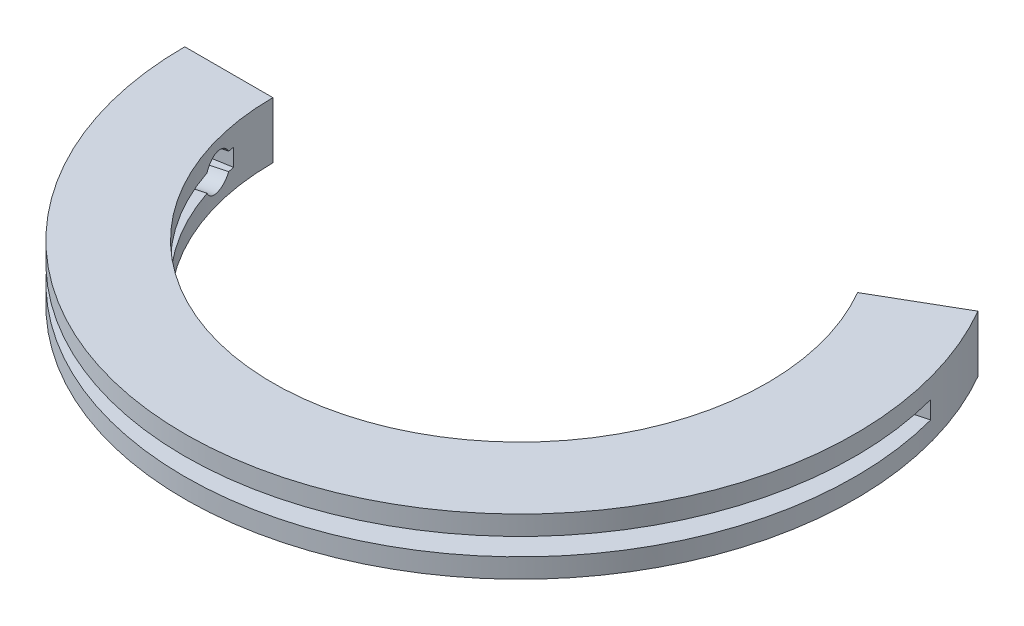
ISO-10303-21;
HEADER;
FILE_DESCRIPTION(('STEP AP214'),'2;1');
FILE_NAME('part.step','',(''),(''),'','','');
FILE_SCHEMA(('AUTOMOTIVE_DESIGN { 1 0 10303 214 1 1 1 1 }'));
ENDSEC;
DATA;
#1=APPLICATION_CONTEXT('core data for automotive mechanical design processes');
#2=APPLICATION_PROTOCOL_DEFINITION('international standard','automotive_design',2000,#1);
#3=PRODUCT_CONTEXT('',#1,'mechanical');
#4=PRODUCT('Part','Part','',(#3));
#5=PRODUCT_RELATED_PRODUCT_CATEGORY('part','',(#4));
#6=PRODUCT_DEFINITION_FORMATION('','',#4);
#7=PRODUCT_DEFINITION_CONTEXT('part definition',#1,'design');
#8=PRODUCT_DEFINITION('design','',#6,#7);
#9=PRODUCT_DEFINITION_SHAPE('','',#8);
#10=(LENGTH_UNIT() NAMED_UNIT(*) SI_UNIT(.MILLI.,.METRE.));
#11=(NAMED_UNIT(*) PLANE_ANGLE_UNIT() SI_UNIT($,.RADIAN.));
#12=(NAMED_UNIT(*) SI_UNIT($,.STERADIAN.) SOLID_ANGLE_UNIT());
#13=UNCERTAINTY_MEASURE_WITH_UNIT(LENGTH_MEASURE(1.E-05),#10,'distance_accuracy_value','');
#14=(GEOMETRIC_REPRESENTATION_CONTEXT(3) GLOBAL_UNCERTAINTY_ASSIGNED_CONTEXT((#13)) GLOBAL_UNIT_ASSIGNED_CONTEXT((#10,
#11,#12)) REPRESENTATION_CONTEXT('',''));
#15=CARTESIAN_POINT('',(0.,0.,0.));
#16=DIRECTION('',(0.,0.,1.));
#17=DIRECTION('',(1.,0.,0.));
#18=AXIS2_PLACEMENT_3D('',#15,#16,#17);
#19=CARTESIAN_POINT('',(-724.444369716801,0.,194.114283826891));
#20=DIRECTION('',(-0.965925826289068,0.,0.258819045102522));
#21=DIRECTION('',(0.,1.,0.));
#22=AXIS2_PLACEMENT_3D('',#19,#20,#21);
#23=SPHERICAL_SURFACE('',#22,50.);
#24=CARTESIAN_POINT('',(-724.444369716801,25.,194.114283826891));
#25=DIRECTION('',(0.,1.,0.));
#26=DIRECTION('',(0.,0.,1.));
#27=AXIS2_PLACEMENT_3D('',#24,#25,#26);
#28=CIRCLE('',#27,43.301270189222);
#29=CARTESIAN_POINT('',(-735.651563118902,25.,152.288468640001));
#30=VERTEX_POINT('',#29);
#31=CARTESIAN_POINT('',(-713.2371763147,25.,235.940099013782));
#32=VERTEX_POINT('',#31);
#33=EDGE_CURVE('E259',#30,#32,#28,.T.);
#34=ORIENTED_EDGE('',*,*,#33,.F.);
#35=CARTESIAN_POINT('',(-724.444369716801,0.,194.114283826891));
#36=DIRECTION('',(-0.965925826289068,0.,0.258819045102522));
#37=DIRECTION('',(0.258819045102522,0.,0.965925826289068));
#38=AXIS2_PLACEMENT_3D('',#35,#36,#37);
#39=CIRCLE('',#38,50.);
#40=EDGE_CURVE('E160',#32,#30,#39,.T.);
#41=ORIENTED_EDGE('',*,*,#40,.F.);
#42=EDGE_LOOP('',(#34,#41));
#43=FACE_BOUND('',#42,.T.);
#44=ADVANCED_FACE('F32',(#43),#23,.F.);
#45=CARTESIAN_POINT('',(-1280.94708628317,0.,343.228737316575));
#46=DIRECTION('',(-0.965925826289068,0.,0.258819045102522));
#47=DIRECTION('',(0.258819045102522,0.,0.965925826289068));
#48=AXIS2_PLACEMENT_3D('',#45,#46,#47);
#49=CYLINDRICAL_SURFACE('',#48,50.);
#50=DIRECTION('',(-0.965925826289068,0.,0.258819045102522));
#51=VECTOR('',#50,1.);
#52=CARTESIAN_POINT('',(-1292.15427968527,25.,301.402922129684));
#53=LINE('',#52,#51);
#54=CARTESIAN_POINT('',(-686.06038122234,25.,139.000551499112));
#55=VERTEX_POINT('',#54);
#56=EDGE_CURVE('E154',#55,#30,#53,.T.);
#57=ORIENTED_EDGE('',*,*,#56,.F.);
#58=CARTESIAN_POINT('',(-661.480052883694,0.,229.006854999987));
#59=CARTESIAN_POINT('',(-661.480056860518,-1.40258138758616,229.006846549775));
#60=CARTESIAN_POINT('',(-661.499434028042,-2.8054197073984,228.950896875702));
#61=CARTESIAN_POINT('',(-661.576734718559,-5.60132910441514,228.7274308773));
#62=CARTESIAN_POINT('',(-661.634667926343,-6.99439763870607,228.559886521788));
#63=CARTESIAN_POINT('',(-661.788489882926,-9.76214309450378,228.114116870368));
#64=CARTESIAN_POINT('',(-661.884418760362,-11.136798977732,227.835774555064));
#65=CARTESIAN_POINT('',(-662.113107699471,-13.8562954036039,227.170324226348));
#66=CARTESIAN_POINT('',(-662.245865436422,-15.2011378223575,226.783223078024));
#67=CARTESIAN_POINT('',(-662.546603499333,-17.8508686524215,225.903107896698));
#68=CARTESIAN_POINT('',(-662.71456540823,-19.1557775474942,225.410149239758));
#69=CARTESIAN_POINT('',(-663.083842382239,-21.7171565764191,224.321528430723));
#70=CARTESIAN_POINT('',(-663.285157945634,-22.9736259862698,223.725864744274));
#71=CARTESIAN_POINT('',(-663.718828420348,-25.4289502750043,222.436011899234));
#72=CARTESIAN_POINT('',(-663.951176133052,-26.6278184283746,221.741845588245));
#73=CARTESIAN_POINT('',(-664.444379843492,-28.959802629931,220.259564886649));
#74=CARTESIAN_POINT('',(-664.70523577528,-30.0929188302085,219.471450713365));
#75=CARTESIAN_POINT('',(-665.25309562952,-32.2872965110593,217.805162802851));
#76=CARTESIAN_POINT('',(-665.540143297786,-33.3484324197237,216.926838075611));
#77=CARTESIAN_POINT('',(-666.136951788072,-35.3892405047489,215.087183020595));
#78=CARTESIAN_POINT('',(-666.44671265503,-36.3689125199236,214.125852528589));
#79=CARTESIAN_POINT('',(-667.085738155942,-38.2399074796553,212.126657885203));
#80=CARTESIAN_POINT('',(-667.415003608845,-39.1312267102929,211.088790519781));
#81=CARTESIAN_POINT('',(-668.08968726731,-40.8191568327122,208.943613763269));
#82=CARTESIAN_POINT('',(-668.435105474441,-41.6157677152921,207.836304365432));
#83=CARTESIAN_POINT('',(-669.139061809278,-43.1094135386094,205.558600073748));
#84=CARTESIAN_POINT('',(-669.497613434707,-43.8063422077315,204.388139657789));
#85=CARTESIAN_POINT('',(-670.224057054372,-45.0946412989423,201.993264471338));
#86=CARTESIAN_POINT('',(-670.591949057573,-45.6860116197257,200.768849649065));
#87=CARTESIAN_POINT('',(-671.333665015696,-46.758945236684,198.274564399644));
#88=CARTESIAN_POINT('',(-671.707488906951,-47.24050971057,197.004694460189));
#89=CARTESIAN_POINT('',(-672.457743510548,-48.0903700470097,194.42834957163));
#90=CARTESIAN_POINT('',(-672.834174218161,-48.458666115037,193.121874688934));
#91=CARTESIAN_POINT('',(-673.585784414219,-49.0787930916927,190.483775689633));
#92=CARTESIAN_POINT('',(-673.960964941045,-49.3308234493488,189.152198751023));
#93=CARTESIAN_POINT('',(-674.707687442592,-49.7175314655896,186.471104676368));
#94=CARTESIAN_POINT('',(-675.079229421056,-49.8522092448415,185.12158755877));
#95=CARTESIAN_POINT('',(-675.815822452492,-50.0032360106719,182.414205016055));
#96=CARTESIAN_POINT('',(-676.180873587895,-50.0195865009989,181.056339697249));
#97=CARTESIAN_POINT('',(-676.901859923549,-49.9338440770811,178.341930016447));
#98=CARTESIAN_POINT('',(-677.257795132622,-49.8317512774516,176.985385653174));
#99=CARTESIAN_POINT('',(-677.957519165851,-49.5101568461637,174.285808578682));
#100=CARTESIAN_POINT('',(-678.301328996231,-49.2908700923299,172.942755707464));
#101=CARTESIAN_POINT('',(-678.975360216599,-48.7366039189557,170.27727418511));
#102=CARTESIAN_POINT('',(-679.305581625794,-48.4016246629511,168.954845504824));
#103=CARTESIAN_POINT('',(-679.950573520756,-47.618378384179,166.340106287112));
#104=CARTESIAN_POINT('',(-680.265343923556,-47.1701107531674,165.047795911432));
#105=CARTESIAN_POINT('',(-680.877827812111,-46.1634978884495,162.502606374039));
#106=CARTESIAN_POINT('',(-681.175541274523,-45.6051525040988,161.249727266291));
#107=CARTESIAN_POINT('',(-681.752822695499,-44.3818089014777,158.791324300111));
#108=CARTESIAN_POINT('',(-682.032373890028,-43.7167140627135,157.585844585988));
#109=CARTESIAN_POINT('',(-682.571921182111,-42.2849672804191,155.232182181465));
#110=CARTESIAN_POINT('',(-682.831917271956,-41.5183152968433,154.083999513658));
#111=CARTESIAN_POINT('',(-683.331468083796,-39.8888775218814,151.853256336317));
#112=CARTESIAN_POINT('',(-683.571022550628,-39.0260905307909,150.770696645976));
#113=CARTESIAN_POINT('',(-684.028999006716,-37.2104854326279,148.679100542756));
#114=CARTESIAN_POINT('',(-684.247420962749,-36.2576671840144,147.670064245468));
#115=CARTESIAN_POINT('',(-684.66308585084,-34.2664899853107,145.730727064911));
#116=CARTESIAN_POINT('',(-684.860280340452,-33.2279445516397,144.800607256753));
#117=CARTESIAN_POINT('',(-685.232566100021,-31.074507670613,143.028495046455));
#118=CARTESIAN_POINT('',(-685.407657334838,-29.9596161018892,142.186502784417));
#119=CARTESIAN_POINT('',(-685.73549803517,-27.6613676894512,140.596890437284));
#120=CARTESIAN_POINT('',(-685.888247467067,-26.4780107427226,139.84927049419));
#121=CARTESIAN_POINT('',(-686.17126272283,-24.0512067471607,138.453982267062));
#122=CARTESIAN_POINT('',(-686.301528561864,-22.8077597388686,137.806313915595));
#123=CARTESIAN_POINT('',(-686.53951703871,-20.2694816561277,136.615739706857));
#124=CARTESIAN_POINT('',(-686.647237806781,-18.974646330456,136.072842538908));
#125=CARTESIAN_POINT('',(-686.840101542475,-16.3428857599096,135.095976921114));
#126=CARTESIAN_POINT('',(-686.925244503092,-15.0059605019737,134.662008505071));
#127=CARTESIAN_POINT('',(-687.072959086921,-12.2995571015854,133.906300368879));
#128=CARTESIAN_POINT('',(-687.13553099457,-10.9300793695867,133.584559234458));
#129=CARTESIAN_POINT('',(-687.238124174431,-8.16832893240193,133.05575275427));
#130=CARTESIAN_POINT('',(-687.278145489522,-6.7760562705665,132.848687190443));
#131=CARTESIAN_POINT('',(-687.335592655065,-3.98176103081782,132.551144957284));
#132=CARTESIAN_POINT('',(-687.353068237415,-2.57976679411023,132.460411682249));
#133=CARTESIAN_POINT('',(-687.365596655805,0.227018455411728,132.395383788135));
#134=CARTESIAN_POINT('',(-687.360649524675,1.63180946412831,132.421088998576));
#135=CARTESIAN_POINT('',(-687.328329857599,4.43416855918009,132.588740941604));
#136=CARTESIAN_POINT('',(-687.30095746903,5.83173669292237,132.730686910271));
#137=CARTESIAN_POINT('',(-687.2237732428,8.60970641167448,133.12973636032));
#138=CARTESIAN_POINT('',(-687.17396140839,9.99010799917104,133.386839825019));
#139=CARTESIAN_POINT('',(-687.051942536315,12.7224885446265,134.013917331289));
#140=CARTESIAN_POINT('',(-686.979759097383,14.0744958571807,134.383772429869));
#141=CARTESIAN_POINT('',(-686.812964316539,16.7420061448988,135.233647435763));
#142=CARTESIAN_POINT('',(-686.718352995976,18.0575091548099,135.713667238211));
#143=CARTESIAN_POINT('',(-686.5067040347,20.6427279067446,136.780264332919));
#144=CARTESIAN_POINT('',(-686.389666187864,21.9124432278051,137.366842604557));
#145=CARTESIAN_POINT('',(-686.133203471021,24.3971239152657,138.642164971958));
#146=CARTESIAN_POINT('',(-685.99377856052,25.612089182626,139.330909252523));
#147=CARTESIAN_POINT('',(-685.692374385554,27.9807911410717,140.806731589988));
#148=CARTESIAN_POINT('',(-685.530356089988,29.1344169970126,141.593979569426));
#149=CARTESIAN_POINT('',(-685.184129282041,31.3700116605293,143.260017403269));
#150=CARTESIAN_POINT('',(-684.999920746575,32.4519803935579,144.138807352905));
#151=CARTESIAN_POINT('',(-684.609597811599,34.5366456254157,145.981455081209));
#152=CARTESIAN_POINT('',(-684.403483165079,35.5393412301519,146.945313819077));
#153=CARTESIAN_POINT('',(-683.969771244316,37.4583743581317,148.95101366246));
#154=CARTESIAN_POINT('',(-683.742173949668,38.3747117993522,149.992854842041));
#155=CARTESIAN_POINT('',(-683.265646488178,40.1161387741617,152.148864992768));
#156=CARTESIAN_POINT('',(-683.016678230322,40.9410591132739,153.26316221327));
#157=CARTESIAN_POINT('',(-682.498542630429,42.4918621423953,155.554229780165));
#158=CARTESIAN_POINT('',(-682.229375259923,43.2177446928143,156.73100021461));
#159=CARTESIAN_POINT('',(-681.671833378434,44.5652874149169,159.138423879435));
#160=CARTESIAN_POINT('',(-681.383458976175,45.1869481764946,160.369076804792));
#161=CARTESIAN_POINT('',(-680.788726601364,46.3215972102922,162.875315008768));
#162=CARTESIAN_POINT('',(-680.482368654065,46.8345856351163,164.150900224287));
#163=CARTESIAN_POINT('',(-679.853440593897,47.7477696193408,166.736521838864));
#164=CARTESIAN_POINT('',(-679.530886020681,48.1480709473853,168.046524661906));
#165=CARTESIAN_POINT('',(-678.871030095053,48.8336370833362,170.692658623856));
#166=CARTESIAN_POINT('',(-678.533728748805,49.1189019393251,172.028789751843));
#167=CARTESIAN_POINT('',(-677.846377519397,49.5723293643979,174.717525758807));
#168=CARTESIAN_POINT('',(-677.49632777766,49.7404932321199,176.070130454924));
#169=CARTESIAN_POINT('',(-676.785730952235,49.9585044152979,178.782099920368));
#170=CARTESIAN_POINT('',(-676.425183885013,50.0083519163355,180.141464679089));
#171=CARTESIAN_POINT('',(-675.696909307602,49.9893906682516,182.85418971655));
#172=CARTESIAN_POINT('',(-675.329199587818,49.9208460732281,184.207556625391));
#173=CARTESIAN_POINT('',(-674.588539598709,49.6661036179087,186.901723007357));
#174=CARTESIAN_POINT('',(-674.215589337722,49.4799059447818,188.242522500473));
#175=CARTESIAN_POINT('',(-673.467369768419,48.9912007226116,190.902095996549));
#176=CARTESIAN_POINT('',(-673.092100458616,48.6886930989456,192.220869985378));
#177=CARTESIAN_POINT('',(-672.342339287545,47.9695450286976,194.82714815312));
#178=CARTESIAN_POINT('',(-671.96784742681,47.5529045039301,196.114652310612));
#179=CARTESIAN_POINT('',(-671.222886736091,46.6084918443262,198.649393239284));
#180=CARTESIAN_POINT('',(-670.852417799818,46.0807226531786,199.89663107607));
#181=CARTESIAN_POINT('',(-670.118826940657,44.9178167594879,202.34225413916));
#182=CARTESIAN_POINT('',(-669.755705017052,44.2826800674214,203.540639370231));
#183=CARTESIAN_POINT('',(-669.040206364611,42.9095745876363,205.880302536396));
#184=CARTESIAN_POINT('',(-668.687829374419,42.1716083035272,207.021581860937));
#185=CARTESIAN_POINT('',(-667.997210261017,40.5980613912815,209.239279636787));
#186=CARTESIAN_POINT('',(-667.658968150438,39.7624806759157,210.315698030134));
#187=CARTESIAN_POINT('',(-666.999285892835,37.9977485179649,212.398561157569));
#188=CARTESIAN_POINT('',(-666.677882606074,37.0684038442327,213.404853854565));
#189=CARTESIAN_POINT('',(-666.05593957394,35.1241830593027,215.338145175708));
#190=CARTESIAN_POINT('',(-665.755399937055,34.1093065034067,216.265143387534));
#191=CARTESIAN_POINT('',(-665.178271628933,32.0009293359055,218.033788101825));
#192=CARTESIAN_POINT('',(-664.901688953831,30.9074091653935,218.87541324542));
#193=CARTESIAN_POINT('',(-664.375536141273,28.6497083415156,220.467344568444));
#194=CARTESIAN_POINT('',(-664.125965599159,27.4855287470788,221.217652115887));
#195=CARTESIAN_POINT('',(-663.656225621069,25.09296880794,222.622919126039));
#196=CARTESIAN_POINT('',(-663.43609981741,23.8644968591869,223.277737215578));
#197=CARTESIAN_POINT('',(-663.028132937029,21.3535471189995,224.486306922875));
#198=CARTESIAN_POINT('',(-662.840293947257,20.0710658431842,225.040052007634));
#199=CARTESIAN_POINT('',(-662.499240490971,17.4627394594927,226.04211174429));
#200=CARTESIAN_POINT('',(-662.345989130761,16.136942300764,226.490538757095));
#201=CARTESIAN_POINT('',(-662.075643832165,13.4502784852559,227.279599242021));
#202=CARTESIAN_POINT('',(-661.958540707886,12.0894208333483,227.620260099932));
#203=CARTESIAN_POINT('',(-661.797232395286,9.83701103329512,228.08871044864));
#204=CARTESIAN_POINT('',(-661.741959951918,8.95285086953849,228.248985582456));
#205=CARTESIAN_POINT('',(-661.647006264743,7.17652852809934,228.524091662724));
#206=CARTESIAN_POINT('',(-661.607326329109,6.28436568543201,228.638918796208));
#207=CARTESIAN_POINT('',(-661.543763958681,4.49477413925579,228.822765140526));
#208=CARTESIAN_POINT('',(-661.519881502903,3.59734544274288,228.891784412205));
#209=CARTESIAN_POINT('',(-661.488025361266,1.79997961886896,228.983830110923));
#210=CARTESIAN_POINT('',(-661.480050331749,0.900042709800643,229.006860422526));
#211=CARTESIAN_POINT('',(-661.480052883694,0.,229.006854999987));
#212=B_SPLINE_CURVE_WITH_KNOTS('',3,(#58,#59,#60,#61,#62,#63,#64,#65,#66,#67,#68,#69,#70,#71,
#72,#73,#74,#75,#76,#77,#78,#79,#80,#81,#82,#83,#84,#85,#86,#87,#88,#89,#90,#91,#92,#93,#94,#95,
#96,#97,#98,#99,#100,#101,#102,#103,#104,#105,#106,#107,#108,#109,#110,#111,#112,#113,#114,#115,
#116,#117,#118,#119,#120,#121,#122,#123,#124,#125,#126,#127,#128,#129,#130,#131,#132,#133,#134,
#135,#136,#137,#138,#139,#140,#141,#142,#143,#144,#145,#146,#147,#148,#149,#150,#151,#152,#153,
#154,#155,#156,#157,#158,#159,#160,#161,#162,#163,#164,#165,#166,#167,#168,#169,#170,#171,#172,
#173,#174,#175,#176,#177,#178,#179,#180,#181,#182,#183,#184,#185,#186,#187,#188,#189,#190,#191,
#192,#193,#194,#195,#196,#197,#198,#199,#200,#201,#202,#203,#204,#205,#206,#207,#208,#209,#210,
#211),.UNSPECIFIED.,.T.,.F.,(4,2,2,2,2,2,2,2,2,2,2,2,2,2,2,2,2,2,2,2,2,2,2,2,2,2,2,2,2,2,2,2,2,
2,2,2,2,2,2,2,2,2,2,2,2,2,2,2,2,2,2,2,2,2,2,2,2,2,2,2,2,2,2,2,2,2,2,2,2,2,2,2,2,2,2,2,4),(0.,
4.20694220807052,8.41494154595928,12.6273970093917,16.8395866334468,21.0495781262248,
25.2596325193256,29.4687119851629,33.6777817145477,37.894014878135,42.110256383843,
46.3266750446504,50.5430941151282,54.7639753466603,58.9848606289919,63.205700638535,
67.4265329912527,71.640097505736,75.8536576876396,80.0671643219141,84.2806668788571,
88.4864702537043,92.692267683508,96.8980876946777,101.103913461669,105.313567675989,
109.523223550244,113.732931964239,117.942646996559,122.161773831617,126.38090737401,
130.60004726476,134.819184309017,139.038671122151,143.258159244674,147.477594191932,
151.697021115741,155.90712472656,160.117222173347,164.327291952124,168.53736112103,
172.743004318691,176.948643512997,181.154321363286,185.360006821108,189.573049935842,
193.786097433467,197.999192441762,202.212291451619,206.433062221876,210.653838941103,
214.874591769977,219.095338671781,223.312110650128,227.528880865964,231.7456043175,
235.962321155011,240.169641886498,244.376955924762,248.584272662377,252.791592282175,
256.998800468247,261.206008243796,265.413113603637,269.620222723017,273.836186276868,
278.052171751746,282.269209405411,286.486183876535,290.70933958275,294.932768162079,
299.151670204802,303.369499267282,306.069117979868,308.768963135341,311.46880470473,
314.168418216245),.UNSPECIFIED.);
#213=CARTESIAN_POINT('',(-663.645994418139,25.,222.652181872893));
#214=VERTEX_POINT('',#213);
#215=EDGE_CURVE('E166',#55,#214,#212,.T.);
#216=ORIENTED_EDGE('',*,*,#215,.T.);
#217=DIRECTION('',(-0.965925826289068,0.,0.258819045102522));
#218=VECTOR('',#217,1.);
#219=CARTESIAN_POINT('',(-1269.73989288106,25.,385.054552503465));
#220=LINE('',#219,#218);
#221=EDGE_CURVE('E261',#32,#214,#220,.F.);
#222=ORIENTED_EDGE('',*,*,#221,.F.);
#223=ORIENTED_EDGE('',*,*,#40,.T.);
#224=EDGE_LOOP('',(#57,#216,#222,#223));
#225=FACE_BOUND('',#224,.T.);
#226=ADVANCED_FACE('F223',(#225),#49,.F.);
#227=CARTESIAN_POINT('',(0.,0.,0.));
#228=DIRECTION('',(0.,-1.,0.));
#229=DIRECTION('',(0.,0.,-1.));
#230=AXIS2_PLACEMENT_3D('',#227,#228,#229);
#231=CYLINDRICAL_SURFACE('',#230,700.);
#232=CARTESIAN_POINT('',(687.361957393947,0.,-132.41427237108));
#233=CARTESIAN_POINT('',(687.361956612871,1.40258138758617,-132.41428167759));
#234=CARTESIAN_POINT('',(687.350762895164,2.80541970739841,-132.472424100433));
#235=CARTESIAN_POINT('',(687.30597425768,5.60132910441518,-132.704601677189));
#236=CARTESIAN_POINT('',(687.272373709587,6.99439763870612,-132.878665949216));
#237=CARTESIAN_POINT('',(687.182702605938,9.76214309450381,-133.341624769873));
#238=CARTESIAN_POINT('',(687.126608293102,11.136798977732,-133.630640724592));
#239=CARTESIAN_POINT('',(686.991933559578,13.8562954036039,-134.321282083771));
#240=CARTESIAN_POINT('',(686.913354558164,15.2011378223576,-134.72290038053));
#241=CARTESIAN_POINT('',(686.733743769867,17.8508686524215,-135.63547151727));
#242=CARTESIAN_POINT('',(686.63272372137,19.1557775474942,-136.146367191644));
#243=CARTESIAN_POINT('',(686.408216557377,21.7171565764191,-137.273778954361));
#244=CARTESIAN_POINT('',(686.28472910623,22.9736259862699,-137.890296620636));
#245=CARTESIAN_POINT('',(686.015372331683,25.4289502750044,-139.224177188941));
#246=CARTESIAN_POINT('',(685.869508197902,26.6278184283747,-139.94151670506));
#247=CARTESIAN_POINT('',(685.555494789585,28.959802629931,-141.471811303402));
#248=CARTESIAN_POINT('',(685.3873455666,30.0929188302086,-142.284766164443));
#249=CARTESIAN_POINT('',(685.028662162828,32.2872965110593,-144.001743752086));
#250=CARTESIAN_POINT('',(684.838090372024,33.3484324197237,-144.905919112781));
#251=CARTESIAN_POINT('',(684.435114158297,35.3892405047489,-146.797511369769));
#252=CARTESIAN_POINT('',(684.222709692178,36.3689125199236,-147.784928430758));
#253=CARTESIAN_POINT('',(683.776524687941,38.2399074796553,-149.835794529496));
#254=CARTESIAN_POINT('',(683.542743252033,39.1312267102928,-150.899246760162));
#255=CARTESIAN_POINT('',(683.054448061526,40.8191568327122,-153.094366156141));
#256=CARTESIAN_POINT('',(682.799934304913,41.6157677152921,-154.226033328083));
#257=CARTESIAN_POINT('',(682.270726228194,43.1094135386095,-156.550561274409));
#258=CARTESIAN_POINT('',(681.996010836404,43.8063422077316,-157.743485541467));
#259=CARTESIAN_POINT('',(681.427691872226,45.0946412989424,-160.18073010166));
#260=CARTESIAN_POINT('',(681.134088281711,45.6860116197257,-161.425050444119));
#261=CARTESIAN_POINT('',(680.529290519128,46.758945236684,-163.956022813464));
#262=CARTESIAN_POINT('',(680.218096535768,47.24050971057,-165.242674386161));
#263=CARTESIAN_POINT('',(679.57966363751,48.0903700470097,-167.848981810362));
#264=CARTESIAN_POINT('',(679.252424751719,48.458666115037,-169.16863760199));
#265=CARTESIAN_POINT('',(678.584288775598,49.0787930916927,-171.829103451112));
#266=CARTESIAN_POINT('',(678.243416173529,49.3308234493488,-173.169873170454));
#267=CARTESIAN_POINT('',(677.549549792119,49.7175314655896,-175.865129999816));
#268=CARTESIAN_POINT('',(677.196556025242,49.8522092448415,-177.219617095729));
#269=CARTESIAN_POINT('',(676.480773031359,50.0032360106719,-179.932575671201));
#270=CARTESIAN_POINT('',(676.117983928895,50.0195865009989,-181.291047099906));
#271=CARTESIAN_POINT('',(675.385171570952,49.9338440770811,-184.002288007586));
#272=CARTESIAN_POINT('',(675.015148322474,49.8317512774516,-185.355057492078));
#273=CARTESIAN_POINT('',(674.271338573643,49.5101568461637,-188.042821834677));
#274=CARTESIAN_POINT('',(673.897560185214,49.2908700923299,-189.377844654967));
#275=CARTESIAN_POINT('',(673.14854758382,48.7366039189557,-192.023234976827));
#276=CARTESIAN_POINT('',(672.773313372912,48.4016246629511,-193.333602513246));
#277=CARTESIAN_POINT('',(672.024523130329,47.618378384179,-195.920529047537));
#278=CARTESIAN_POINT('',(671.650967107673,47.1701107531673,-197.19708786385));
#279=CARTESIAN_POINT('',(670.908798945874,46.1634978884494,-199.707528604956));
#280=CARTESIAN_POINT('',(670.540186813498,45.6051525040987,-200.941410471342));
#281=CARTESIAN_POINT('',(669.810925706106,44.3818089014777,-203.359090603281));
#282=CARTESIAN_POINT('',(669.450284285164,43.7167140627135,-204.542842256723));
#283=CARTESIAN_POINT('',(668.74071474439,42.2849672804191,-206.850947337014));
#284=CARTESIAN_POINT('',(668.391786629177,41.5183152968432,-207.975300740443));
#285=CARTESIAN_POINT('',(667.709038734041,39.8888775218813,-210.156956407259));
#286=CARTESIAN_POINT('',(667.375219142737,39.0260905307909,-211.214257833622));
#287=CARTESIAN_POINT('',(666.726040336434,37.2104854326279,-213.254621421512));
#288=CARTESIAN_POINT('',(666.410681150459,36.2576671840144,-214.23768346632));
#289=CARTESIAN_POINT('',(665.800988912729,34.2664899853107,-216.125031175231));
#290=CARTESIAN_POINT('',(665.50670444614,33.2279445516397,-217.029135802465));
#291=CARTESIAN_POINT('',(664.943057266244,31.0745076706129,-218.749972874725));
#292=CARTESIAN_POINT('',(664.673694592557,29.9596161018892,-219.566705180849));
#293=CARTESIAN_POINT('',(664.162806793873,27.6613676894512,-221.1072702058));
#294=CARTESIAN_POINT('',(663.921281710762,26.4780107427225,-221.831102784844));
#295=CARTESIAN_POINT('',(663.468735998348,24.0512067471607,-223.18096546302));
#296=CARTESIAN_POINT('',(663.257715348463,22.8077597388685,-223.806995628135));
#297=CARTESIAN_POINT('',(662.86853231085,20.2694816561276,-224.957057376415));
#298=CARTESIAN_POINT('',(662.690372648541,18.974646330456,-225.481080499537));
#299=CARTESIAN_POINT('',(662.368964734224,16.3428857599096,-226.423502808478));
#300=CARTESIAN_POINT('',(662.22571649305,15.0059605019736,-226.84190196152));
#301=CARTESIAN_POINT('',(661.975787007059,12.2995571015854,-227.570221697223));
#302=CARTESIAN_POINT('',(661.869105301436,10.9300793695867,-227.880143646898));
#303=CARTESIAN_POINT('',(661.693550361356,8.1683289324019,-228.389400082357));
#304=CARTESIAN_POINT('',(661.624677055005,6.77605627056647,-228.588734778426));
#305=CARTESIAN_POINT('',(661.525656643161,3.9817610308178,-228.875137493813));
#306=CARTESIAN_POINT('',(661.495424303904,2.57976679411021,-228.962452606136));
#307=CARTESIAN_POINT('',(661.473760285442,-0.227018455411753,-229.025032623589));
#308=CARTESIAN_POINT('',(661.482328549428,-1.63180946412835,-229.000297692771));
#309=CARTESIAN_POINT('',(661.538164868213,-4.43416855918012,-228.838947017578));
#310=CARTESIAN_POINT('',(661.585432668683,-5.83173669292239,-228.702332008463));
#311=CARTESIAN_POINT('',(661.718113893021,-8.60970641167451,-228.31815293424));
#312=CARTESIAN_POINT('',(661.803527311362,-9.99010799917108,-228.070588885203));
#313=CARTESIAN_POINT('',(662.011394621539,-12.7224885446265,-227.466514398595));
#314=CARTESIAN_POINT('',(662.133809478981,-14.0744958571808,-227.11011876804));
#315=CARTESIAN_POINT('',(662.414298464499,-16.7420061448988,-226.290708032472));
#316=CARTESIAN_POINT('',(662.57237255863,-18.0575091548099,-225.827693028951));
#317=CARTESIAN_POINT('',(662.922377728834,-20.6427279067446,-224.798168368693));
#318=CARTESIAN_POINT('',(663.114309116089,-21.9124432278051,-224.231657760728));
#319=CARTESIAN_POINT('',(663.52986707188,-24.3971239152657,-222.998964834123));
#320=CARTESIAN_POINT('',(663.753493697748,-25.612089182626,-222.332782335192));
#321=CARTESIAN_POINT('',(664.230381194154,-27.9807911410718,-220.903980611992));
#322=CARTESIAN_POINT('',(664.483693224035,-29.1344169970127,-220.141194714937));
#323=CARTESIAN_POINT('',(665.016870929803,-31.3700116605293,-218.52525022319));
#324=CARTESIAN_POINT('',(665.296736633314,-32.4519803935579,-217.672091534481));
#325=CARTESIAN_POINT('',(665.880030920097,-34.5366456254157,-215.881150324057));
#326=CARTESIAN_POINT('',(666.183459769052,-35.5393412301519,-214.943366848143));
#327=CARTESIAN_POINT('',(666.810704149438,-37.4583743581318,-212.989523871025));
#328=CARTESIAN_POINT('',(667.134519700232,-38.3747117993523,-211.973464295476));
#329=CARTESIAN_POINT('',(667.799839888344,-40.1161387741618,-209.868041003384));
#330=CARTESIAN_POINT('',(668.141375662555,-40.9410591132739,-208.778547174135));
#331=CARTESIAN_POINT('',(668.838190853891,-42.4918621423954,-206.53535665947));
#332=CARTESIAN_POINT('',(669.193470290385,-43.2177446928144,-205.381659883566));
#333=CARTESIAN_POINT('',(669.914336689754,-44.5652874149169,-203.017998891411));
#334=CARTESIAN_POINT('',(670.279923594275,-45.1869481764946,-201.808034993681));
#335=CARTESIAN_POINT('',(671.017989351223,-46.3215972102922,-199.340202853697));
#336=CARTESIAN_POINT('',(671.390468193971,-46.8345856351164,-198.082334678716));
#337=CARTESIAN_POINT('',(672.138611324002,-47.7477696193409,-195.528656645834));
#338=CARTESIAN_POINT('',(672.51427228101,-48.1480709473853,-194.232883635442));
#339=CARTESIAN_POINT('',(673.265887267554,-48.8336370833362,-191.611336439763));
#340=CARTESIAN_POINT('',(673.641841296966,-49.1189019393251,-190.285562267015));
#341=CARTESIAN_POINT('',(674.390945674458,-49.5723293643979,-187.613372966211));
#342=CARTESIAN_POINT('',(674.764096053584,-49.7404932321199,-186.266958067227));
#343=CARTESIAN_POINT('',(675.50468588364,-49.9585044152979,-183.563025203151));
#344=CARTESIAN_POINT('',(675.872125343525,-50.0083519163356,-182.205507255479));
#345=CARTESIAN_POINT('',(676.597783577288,-49.9893906682516,-179.49208117085));
#346=CARTESIAN_POINT('',(676.956021073157,-49.9208460732281,-178.136176187261));
#347=CARTESIAN_POINT('',(677.661673898005,-49.6661036179087,-175.432629663902));
#348=CARTESIAN_POINT('',(678.0090892442,-49.4799059447818,-174.084988110989));
#349=CARTESIAN_POINT('',(678.690898837613,-48.9912007226116,-171.407620115504));
#350=CARTESIAN_POINT('',(679.025293076477,-48.6886930989456,-170.077893684426));
#351=CARTESIAN_POINT('',(679.679119939429,-47.9695450286976,-167.445909996297));
#352=CARTESIAN_POINT('',(679.998552553268,-47.5529045039301,-166.143652758064));
#353=CARTESIAN_POINT('',(680.620768134621,-46.6084918443263,-163.576022376462));
#354=CARTESIAN_POINT('',(680.923551542889,-46.0807226531786,-162.310648257107));
#355=CARTESIAN_POINT('',(681.511054754416,-44.9178167594879,-159.82588112681));
#356=CARTESIAN_POINT('',(681.79577455944,-44.2826800674214,-158.60648811138));
#357=CARTESIAN_POINT('',(682.345966133134,-42.9095745876363,-156.222531046962));
#358=CARTESIAN_POINT('',(682.611438370189,-42.1716083035272,-155.057965663999));
#359=CARTESIAN_POINT('',(683.122193561569,-40.5980613912815,-152.792073495496));
#360=CARTESIAN_POINT('',(683.367476497851,-39.7624806759157,-151.690746766467));
#361=CARTESIAN_POINT('',(683.837606468058,-37.9977485179649,-149.557093256701));
#362=CARTESIAN_POINT('',(684.062409405362,-37.0684038442326,-148.524916574079));
#363=CARTESIAN_POINT('',(684.490436600398,-35.1241830593026,-146.539665660987));
#364=CARTESIAN_POINT('',(684.693660745925,-34.1093065034067,-145.58659184184));
#365=CARTESIAN_POINT('',(685.078175326994,-32.0009293359054,-143.766336434934));
#366=CARTESIAN_POINT('',(685.259460275906,-30.9074091653934,-142.899176342565));
#367=CARTESIAN_POINT('',(685.599764235471,-28.6497083415156,-141.257446969468));
#368=CARTESIAN_POINT('',(685.758783579685,-27.4855287470788,-140.482876301674));
#369=CARTESIAN_POINT('',(686.054610330562,-25.09296880794,-139.031009382738));
#370=CARTESIAN_POINT('',(686.191384837335,-23.8644968591869,-138.353857380509));
#371=CARTESIAN_POINT('',(686.442360008671,-21.3535471189994,-137.103221871556));
#372=CARTESIAN_POINT('',(686.556559214086,-20.0710658431842,-136.529745066048));
#373=CARTESIAN_POINT('',(686.762228125222,-17.4627394594926,-135.491409149851));
#374=CARTESIAN_POINT('',(686.853722060518,-16.136942300764,-135.026434284913));
#375=CARTESIAN_POINT('',(687.014126406603,-13.4502784852558,-134.207915210546));
#376=CARTESIAN_POINT('',(687.083042555071,-12.0894208333482,-133.854342691381));
#377=CARTESIAN_POINT('',(687.177570632871,-9.83701103329505,-133.367998632689));
#378=CARTESIAN_POINT('',(687.209840859694,-8.95285086953841,-133.201560073525));
#379=CARTESIAN_POINT('',(687.265161594551,-7.17652852809927,-132.91583437569));
#380=CARTESIAN_POINT('',(687.288211329014,-6.28436568543196,-132.796551193232));
#381=CARTESIAN_POINT('',(687.325087873657,-4.49477413925577,-132.605554403445));
#382=CARTESIAN_POINT('',(687.338914696088,-3.59734544274287,-132.533840732933));
#383=CARTESIAN_POINT('',(687.357349317523,-1.79997961886896,-132.438198748714));
#384=CARTESIAN_POINT('',(687.361957895166,-0.900042709800646,-132.414266399051));
#385=CARTESIAN_POINT('',(687.361957393947,0.,-132.41427237108));
#386=B_SPLINE_CURVE_WITH_KNOTS('',3,(#232,#233,#234,#235,#236,#237,#238,#239,#240,#241,#242,
#243,#244,#245,#246,#247,#248,#249,#250,#251,#252,#253,#254,#255,#256,#257,#258,#259,#260,#261,
#262,#263,#264,#265,#266,#267,#268,#269,#270,#271,#272,#273,#274,#275,#276,#277,#278,#279,#280,
#281,#282,#283,#284,#285,#286,#287,#288,#289,#290,#291,#292,#293,#294,#295,#296,#297,#298,#299,
#300,#301,#302,#303,#304,#305,#306,#307,#308,#309,#310,#311,#312,#313,#314,#315,#316,#317,#318,
#319,#320,#321,#322,#323,#324,#325,#326,#327,#328,#329,#330,#331,#332,#333,#334,#335,#336,#337,
#338,#339,#340,#341,#342,#343,#344,#345,#346,#347,#348,#349,#350,#351,#352,#353,#354,#355,#356,
#357,#358,#359,#360,#361,#362,#363,#364,#365,#366,#367,#368,#369,#370,#371,#372,#373,#374,#375,
#376,#377,#378,#379,#380,#381,#382,#383,#384,#385),.UNSPECIFIED.,.T.,.F.,(4,2,2,2,2,2,2,2,2,2,2,
2,2,2,2,2,2,2,2,2,2,2,2,2,2,2,2,2,2,2,2,2,2,2,2,2,2,2,2,2,2,2,2,2,2,2,2,2,2,2,2,2,2,2,2,2,2,2,2,
2,2,2,2,2,2,2,2,2,2,2,2,2,2,2,2,2,4),(0.,4.20694220807055,8.41494154595931,12.6273970093917,
16.8395866334468,21.0495781262248,25.2596325193256,29.468711985163,33.6777817145478,
37.8940148781351,42.1102563838431,46.3266750446504,50.5430941151283,54.7639753466604,
58.984860628992,63.2057006385351,67.4265329912529,71.6400975057361,75.8536576876397,
80.0671643219143,84.2806668788571,88.4864702537043,92.692267683508,96.8980876946778,
101.103913461669,105.313567675989,109.523223550244,113.732931964239,117.942646996559,
122.161773831617,126.38090737401,130.60004726476,134.819184309018,139.038671122151,
143.258159244674,147.477594191932,151.697021115741,155.90712472656,160.117222173347,
164.327291952124,168.53736112103,172.743004318691,176.948643512997,181.154321363286,
185.360006821108,189.573049935843,193.786097433468,197.999192441762,202.212291451619,
206.433062221876,210.653838941104,214.874591769978,219.095338671781,223.312110650129,
227.528880865965,231.7456043175,235.962321155011,240.169641886498,244.376955924762,
248.584272662377,252.791592282175,256.998800468247,261.206008243796,265.413113603637,
269.620222723017,273.836186276869,278.052171751746,282.269209405411,286.486183876535,
290.70933958275,294.932768162079,299.151670204802,303.369499267282,306.069117979868,
308.768963135341,311.46880470473,314.168418216245),.UNSPECIFIED.);
#387=CARTESIAN_POINT('',(686.060381222341,25.,-139.000551499112));
#388=VERTEX_POINT('',#387);
#389=CARTESIAN_POINT('',(686.060381222341,-25.,-139.000551499112));
#390=VERTEX_POINT('',#389);
#391=EDGE_CURVE('E170',#388,#390,#386,.T.);
#392=ORIENTED_EDGE('',*,*,#391,.F.);
#393=CARTESIAN_POINT('',(0.,25.,0.));
#394=DIRECTION('',(0.,1.,0.));
#395=DIRECTION('',(0.,0.,1.));
#396=AXIS2_PLACEMENT_3D('',#393,#394,#395);
#397=CIRCLE('',#396,700.);
#398=EDGE_CURVE('E156',#388,#214,#397,.F.);
#399=ORIENTED_EDGE('',*,*,#398,.T.);
#400=ORIENTED_EDGE('',*,*,#215,.F.);
#401=CARTESIAN_POINT('',(-689.365427108546,25.,121.553724366852));
#402=VERTEX_POINT('',#401);
#403=EDGE_CURVE('E148',#55,#402,#397,.F.);
#404=ORIENTED_EDGE('',*,*,#403,.T.);
#405=DIRECTION('',(0.,-1.,0.));
#406=VECTOR('',#405,1.);
#407=CARTESIAN_POINT('',(-689.365427108546,0.,121.553724366852));
#408=LINE('',#407,#406);
#409=CARTESIAN_POINT('',(-689.365427108546,-25.,121.553724366852));
#410=VERTEX_POINT('',#409);
#411=EDGE_CURVE('E147',#402,#410,#408,.T.);
#412=ORIENTED_EDGE('',*,*,#411,.T.);
#413=CARTESIAN_POINT('',(0.,-25.,0.));
#414=DIRECTION('',(0.,-1.,0.));
#415=DIRECTION('',(0.,0.,-1.));
#416=AXIS2_PLACEMENT_3D('',#413,#414,#415);
#417=CIRCLE('',#416,700.);
#418=CARTESIAN_POINT('',(-686.06038122234,-25.,139.000551499112));
#419=VERTEX_POINT('',#418);
#420=EDGE_CURVE('E272',#410,#419,#417,.F.);
#421=ORIENTED_EDGE('',*,*,#420,.T.);
#422=CARTESIAN_POINT('',(-663.645994418139,-25.,222.652181872893));
#423=VERTEX_POINT('',#422);
#424=EDGE_CURVE('E200',#423,#419,#212,.T.);
#425=ORIENTED_EDGE('',*,*,#424,.F.);
#426=EDGE_CURVE('E279',#423,#390,#417,.F.);
#427=ORIENTED_EDGE('',*,*,#426,.T.);
#428=EDGE_LOOP('',(#392,#399,#400,#404,#412,#421,#425,#427));
#429=FACE_BOUND('',#428,.T.);
#430=CARTESIAN_POINT('',(0.,79.9999999999999,0.));
#431=DIRECTION('',(0.,-1.,0.));
#432=DIRECTION('',(0.,0.,-1.));
#433=AXIS2_PLACEMENT_3D('',#430,#431,#432);
#434=CIRCLE('',#433,700.);
#435=CARTESIAN_POINT('',(606.217782649104,79.9999999999999,-350.000000000005));
#436=VERTEX_POINT('',#435);
#437=CARTESIAN_POINT('',(-700.,79.9999999999999,0.));
#438=VERTEX_POINT('',#437);
#439=EDGE_CURVE('E192',#436,#438,#434,.T.);
#440=ORIENTED_EDGE('',*,*,#439,.F.);
#441=DIRECTION('',(0.,1.,0.));
#442=VECTOR('',#441,1.);
#443=CARTESIAN_POINT('',(606.217782649104,79.9999999999999,-350.000000000005));
#444=LINE('',#443,#442);
#445=CARTESIAN_POINT('',(606.217782649104,-80.0000000000001,-350.000000000005));
#446=VERTEX_POINT('',#445);
#447=EDGE_CURVE('E184',#446,#436,#444,.T.);
#448=ORIENTED_EDGE('',*,*,#447,.F.);
#449=CARTESIAN_POINT('',(0.,-80.0000000000001,0.));
#450=DIRECTION('',(0.,-1.,0.));
#451=DIRECTION('',(0.,0.,-1.));
#452=AXIS2_PLACEMENT_3D('',#449,#450,#451);
#453=CIRCLE('',#452,700.);
#454=CARTESIAN_POINT('',(-700.,-80.0000000000001,0.));
#455=VERTEX_POINT('',#454);
#456=EDGE_CURVE('E194',#446,#455,#453,.T.);
#457=ORIENTED_EDGE('',*,*,#456,.T.);
#458=DIRECTION('',(0.,1.,0.));
#459=VECTOR('',#458,1.);
#460=CARTESIAN_POINT('',(-700.,79.9999999999999,0.));
#461=LINE('',#460,#459);
#462=EDGE_CURVE('E173',#455,#438,#461,.T.);
#463=ORIENTED_EDGE('',*,*,#462,.T.);
#464=EDGE_LOOP('',(#440,#448,#457,#463));
#465=FACE_BOUND('',#464,.T.);
#466=ADVANCED_FACE('F212',(#429,#465),#231,.F.);
#467=CARTESIAN_POINT('',(0.,0.,0.));
#468=DIRECTION('',(0.,-1.,0.));
#469=DIRECTION('',(0.,0.,-1.));
#470=AXIS2_PLACEMENT_3D('',#467,#468,#469);
#471=CYLINDRICAL_SURFACE('',#470,949.526197637537);
#472=CARTESIAN_POINT('',(0.,-25.,0.));
#473=DIRECTION('',(0.,-1.,0.));
#474=DIRECTION('',(0.,0.,-1.));
#475=AXIS2_PLACEMENT_3D('',#472,#473,#474);
#476=CIRCLE('',#475,949.526197637537);
#477=CARTESIAN_POINT('',(917.171877036154,-25.,-245.755463772382));
#478=VERTEX_POINT('',#477);
#479=CARTESIAN_POINT('',(-935.100761121649,-25.,164.883493866768));
#480=VERTEX_POINT('',#479);
#481=EDGE_CURVE('E270',#478,#480,#476,.T.);
#482=ORIENTED_EDGE('',*,*,#481,.T.);
#483=DIRECTION('',(0.,-1.,0.));
#484=VECTOR('',#483,1.);
#485=CARTESIAN_POINT('',(-935.100761121649,0.,164.883493866768));
#486=LINE('',#485,#484);
#487=CARTESIAN_POINT('',(-935.100761121649,25.,164.883493866768));
#488=VERTEX_POINT('',#487);
#489=EDGE_CURVE('E11',#480,#488,#486,.F.);
#490=ORIENTED_EDGE('',*,*,#489,.T.);
#491=CARTESIAN_POINT('',(0.,25.,0.));
#492=DIRECTION('',(0.,1.,0.));
#493=DIRECTION('',(0.,0.,1.));
#494=AXIS2_PLACEMENT_3D('',#491,#492,#493);
#495=CIRCLE('',#494,949.526197637537);
#496=CARTESIAN_POINT('',(917.171877036154,25.,-245.755463772382));
#497=VERTEX_POINT('',#496);
#498=EDGE_CURVE('E141',#488,#497,#495,.T.);
#499=ORIENTED_EDGE('',*,*,#498,.T.);
#500=DIRECTION('',(0.,-1.,0.));
#501=VECTOR('',#500,1.);
#502=CARTESIAN_POINT('',(917.171877036154,0.,-245.755463772382));
#503=LINE('',#502,#501);
#504=EDGE_CURVE('E130',#478,#497,#503,.F.);
#505=ORIENTED_EDGE('',*,*,#504,.F.);
#506=EDGE_LOOP('',(#482,#490,#499,#505));
#507=FACE_BOUND('',#506,.T.);
#508=CARTESIAN_POINT('',(0.,-80.0000000000001,0.));
#509=DIRECTION('',(0.,-1.,0.));
#510=DIRECTION('',(0.,0.,-1.));
#511=AXIS2_PLACEMENT_3D('',#508,#509,#510);
#512=CIRCLE('',#511,949.526197637537);
#513=CARTESIAN_POINT('',(822.313808712947,-80.0000000000001,-474.763098818775));
#514=VERTEX_POINT('',#513);
#515=CARTESIAN_POINT('',(-949.526197637537,-80.0000000000001,0.));
#516=VERTEX_POINT('',#515);
#517=EDGE_CURVE('E196',#514,#516,#512,.T.);
#518=ORIENTED_EDGE('',*,*,#517,.F.);
#519=DIRECTION('',(0.,-1.,0.));
#520=VECTOR('',#519,1.);
#521=CARTESIAN_POINT('',(822.313808712947,79.9999999999999,-474.763098818775));
#522=LINE('',#521,#520);
#523=CARTESIAN_POINT('',(822.313808712947,79.9999999999999,-474.763098818775));
#524=VERTEX_POINT('',#523);
#525=EDGE_CURVE('E179',#524,#514,#522,.T.);
#526=ORIENTED_EDGE('',*,*,#525,.F.);
#527=CARTESIAN_POINT('',(0.,79.9999999999999,0.));
#528=DIRECTION('',(0.,-1.,0.));
#529=DIRECTION('',(0.,0.,-1.));
#530=AXIS2_PLACEMENT_3D('',#527,#528,#529);
#531=CIRCLE('',#530,949.526197637537);
#532=CARTESIAN_POINT('',(-949.526197637537,79.9999999999999,0.));
#533=VERTEX_POINT('',#532);
#534=EDGE_CURVE('E190',#524,#533,#531,.T.);
#535=ORIENTED_EDGE('',*,*,#534,.T.);
#536=DIRECTION('',(0.,-1.,0.));
#537=VECTOR('',#536,1.);
#538=CARTESIAN_POINT('',(-949.526197637537,79.9999999999999,0.));
#539=LINE('',#538,#537);
#540=EDGE_CURVE('E167',#533,#516,#539,.T.);
#541=ORIENTED_EDGE('',*,*,#540,.T.);
#542=EDGE_LOOP('',(#518,#526,#535,#541));
#543=FACE_BOUND('',#542,.T.);
#544=ADVANCED_FACE('F34',(#507,#543),#471,.T.);
#545=CARTESIAN_POINT('',(822.313808712947,-80.0000000000001,-474.763098818775));
#546=DIRECTION('',(0.,1.,0.));
#547=DIRECTION('',(0.,0.,1.));
#548=AXIS2_PLACEMENT_3D('',#545,#546,#547);
#549=PLANE('',#548);
#550=ORIENTED_EDGE('',*,*,#456,.F.);
#551=DIRECTION('',(-0.866025403784434,0.,0.500000000000007));
#552=VECTOR('',#551,1.);
#553=CARTESIAN_POINT('',(822.313808712947,-80.0000000000001,-474.763098818775));
#554=LINE('',#553,#552);
#555=EDGE_CURVE('E181',#514,#446,#554,.T.);
#556=ORIENTED_EDGE('',*,*,#555,.F.);
#557=ORIENTED_EDGE('',*,*,#517,.T.);
#558=DIRECTION('',(1.,0.,0.));
#559=VECTOR('',#558,1.);
#560=CARTESIAN_POINT('',(-949.526197637537,-80.0000000000001,0.));
#561=LINE('',#560,#559);
#562=EDGE_CURVE('E169',#516,#455,#561,.T.);
#563=ORIENTED_EDGE('',*,*,#562,.T.);
#564=EDGE_LOOP('',(#550,#556,#557,#563));
#565=FACE_BOUND('',#564,.T.);
#566=ADVANCED_FACE('F244',(#565),#549,.F.);
#567=CARTESIAN_POINT('',(606.217782649104,79.9999999999999,-350.000000000005));
#568=DIRECTION('',(0.,-1.,0.));
#569=DIRECTION('',(0.,0.,-1.));
#570=AXIS2_PLACEMENT_3D('',#567,#568,#569);
#571=PLANE('',#570);
#572=DIRECTION('',(0.866025403784434,0.,-0.500000000000007));
#573=VECTOR('',#572,1.);
#574=CARTESIAN_POINT('',(606.217782649104,79.9999999999999,-350.000000000005));
#575=LINE('',#574,#573);
#576=EDGE_CURVE('E187',#436,#524,#575,.T.);
#577=ORIENTED_EDGE('',*,*,#576,.F.);
#578=ORIENTED_EDGE('',*,*,#439,.T.);
#579=DIRECTION('',(-1.,0.,0.));
#580=VECTOR('',#579,1.);
#581=CARTESIAN_POINT('',(-700.,79.9999999999999,0.));
#582=LINE('',#581,#580);
#583=EDGE_CURVE('E176',#438,#533,#582,.T.);
#584=ORIENTED_EDGE('',*,*,#583,.T.);
#585=ORIENTED_EDGE('',*,*,#534,.F.);
#586=EDGE_LOOP('',(#577,#578,#584,#585));
#587=FACE_BOUND('',#586,.T.);
#588=ADVANCED_FACE('F241',(#587),#571,.F.);
#589=CARTESIAN_POINT('',(0.,0.,0.));
#590=DIRECTION('',(-0.500000000000007,0.,-0.866025403784435));
#591=DIRECTION('',(-0.866025403784435,0.,0.500000000000007));
#592=AXIS2_PLACEMENT_3D('',#589,#590,#591);
#593=PLANE('',#592);
#594=ORIENTED_EDGE('',*,*,#525,.T.);
#595=ORIENTED_EDGE('',*,*,#555,.T.);
#596=ORIENTED_EDGE('',*,*,#447,.T.);
#597=ORIENTED_EDGE('',*,*,#576,.T.);
#598=EDGE_LOOP('',(#594,#595,#596,#597));
#599=FACE_BOUND('',#598,.T.);
#600=ADVANCED_FACE('F238',(#599),#593,.T.);
#601=CARTESIAN_POINT('',(0.,0.,0.));
#602=DIRECTION('',(0.,0.,1.));
#603=DIRECTION('',(1.,0.,0.));
#604=AXIS2_PLACEMENT_3D('',#601,#602,#603);
#605=PLANE('',#604);
#606=ORIENTED_EDGE('',*,*,#540,.F.);
#607=ORIENTED_EDGE('',*,*,#583,.F.);
#608=ORIENTED_EDGE('',*,*,#462,.F.);
#609=ORIENTED_EDGE('',*,*,#562,.F.);
#610=EDGE_LOOP('',(#606,#607,#608,#609));
#611=FACE_BOUND('',#610,.T.);
#612=ADVANCED_FACE('F234',(#611),#605,.F.);
#613=CARTESIAN_POINT('',(-724.444369716801,-25.,194.114283826891));
#614=DIRECTION('',(0.,-1.,0.));
#615=DIRECTION('',(0.,0.,-1.));
#616=AXIS2_PLACEMENT_3D('',#613,#614,#615);
#617=CIRCLE('',#616,43.301270189222);
#618=CARTESIAN_POINT('',(-713.2371763147,-25.,235.940099013782));
#619=VERTEX_POINT('',#618);
#620=CARTESIAN_POINT('',(-735.651563118902,-25.,152.288468640001));
#621=VERTEX_POINT('',#620);
#622=EDGE_CURVE('E275',#619,#621,#617,.T.);
#623=ORIENTED_EDGE('',*,*,#622,.F.);
#624=EDGE_CURVE('E151',#621,#619,#39,.T.);
#625=ORIENTED_EDGE('',*,*,#624,.F.);
#626=EDGE_LOOP('',(#623,#625));
#627=FACE_BOUND('',#626,.T.);
#628=ADVANCED_FACE('F231',(#627),#23,.F.);
#629=DIRECTION('',(-0.965925826289068,0.,0.258819045102522));
#630=VECTOR('',#629,1.);
#631=CARTESIAN_POINT('',(-1269.73989288106,-25.,385.054552503465));
#632=LINE('',#631,#630);
#633=EDGE_CURVE('E277',#423,#619,#632,.T.);
#634=ORIENTED_EDGE('',*,*,#633,.F.);
#635=ORIENTED_EDGE('',*,*,#424,.T.);
#636=DIRECTION('',(-0.965925826289068,0.,0.258819045102522));
#637=VECTOR('',#636,1.);
#638=CARTESIAN_POINT('',(-1292.15427968527,-25.,301.402922129684));
#639=LINE('',#638,#637);
#640=EDGE_CURVE('E273',#621,#419,#639,.F.);
#641=ORIENTED_EDGE('',*,*,#640,.F.);
#642=ORIENTED_EDGE('',*,*,#624,.T.);
#643=EDGE_LOOP('',(#634,#635,#641,#642));
#644=FACE_BOUND('',#643,.T.);
#645=ADVANCED_FACE('F221',(#644),#49,.F.);
#646=DIRECTION('',(-0.965925826289068,0.,0.258819045102522));
#647=VECTOR('',#646,1.);
#648=CARTESIAN_POINT('',(-1269.73989288106,25.,385.054552503465));
#649=LINE('',#648,#647);
#650=CARTESIAN_POINT('',(735.651563118903,25.,-152.288468640001));
#651=VERTEX_POINT('',#650);
#652=EDGE_CURVE('E267',#388,#651,#649,.F.);
#653=ORIENTED_EDGE('',*,*,#652,.F.);
#654=ORIENTED_EDGE('',*,*,#391,.T.);
#655=DIRECTION('',(-0.965925826289068,0.,0.258819045102522));
#656=VECTOR('',#655,1.);
#657=CARTESIAN_POINT('',(-1269.73989288106,-25.,385.054552503465));
#658=LINE('',#657,#656);
#659=CARTESIAN_POINT('',(735.651563118903,-25.,-152.288468640001));
#660=VERTEX_POINT('',#659);
#661=EDGE_CURVE('E135',#660,#390,#658,.T.);
#662=ORIENTED_EDGE('',*,*,#661,.F.);
#663=CARTESIAN_POINT('',(724.444369716802,0.,-194.114283826891));
#664=DIRECTION('',(-0.965925826289068,0.,0.258819045102522));
#665=DIRECTION('',(0.258819045102522,0.,0.965925826289068));
#666=AXIS2_PLACEMENT_3D('',#663,#664,#665);
#667=CIRCLE('',#666,50.);
#668=EDGE_CURVE('E163',#651,#660,#667,.T.);
#669=ORIENTED_EDGE('',*,*,#668,.F.);
#670=EDGE_LOOP('',(#653,#654,#662,#669));
#671=FACE_BOUND('',#670,.T.);
#672=ADVANCED_FACE('F215',(#671),#49,.F.);
#673=CARTESIAN_POINT('',(724.444369716801,0.,-194.114283826891));
#674=DIRECTION('',(-0.965925826289068,0.,0.258819045102522));
#675=DIRECTION('',(0.,1.,0.));
#676=AXIS2_PLACEMENT_3D('',#673,#674,#675);
#677=SPHERICAL_SURFACE('',#676,50.);
#678=CARTESIAN_POINT('',(724.444369716801,25.,-194.114283826891));
#679=DIRECTION('',(0.,1.,0.));
#680=DIRECTION('',(0.,0.,1.));
#681=AXIS2_PLACEMENT_3D('',#678,#679,#680);
#682=CIRCLE('',#681,43.301270189222);
#683=CARTESIAN_POINT('',(766.27018490369,25.,-205.321477228997));
#684=VERTEX_POINT('',#683);
#685=EDGE_CURVE('E40',#651,#684,#682,.T.);
#686=ORIENTED_EDGE('',*,*,#685,.F.);
#687=ORIENTED_EDGE('',*,*,#668,.T.);
#688=CARTESIAN_POINT('',(724.444369716801,-25.,-194.114283826891));
#689=DIRECTION('',(0.,-1.,0.));
#690=DIRECTION('',(0.,0.,-1.));
#691=AXIS2_PLACEMENT_3D('',#688,#689,#690);
#692=CIRCLE('',#691,43.301270189222);
#693=CARTESIAN_POINT('',(766.27018490369,-25.,-205.321477228997));
#694=VERTEX_POINT('',#693);
#695=EDGE_CURVE('E289',#694,#660,#692,.T.);
#696=ORIENTED_EDGE('',*,*,#695,.F.);
#697=CARTESIAN_POINT('',(724.4443697168,0.,-194.114283826896));
#698=DIRECTION('',(0.258819045102528,0.,0.965925826289066));
#699=DIRECTION('',(0.965925826289066,0.,-0.258819045102528));
#700=AXIS2_PLACEMENT_3D('',#697,#698,#699);
#701=CIRCLE('',#700,50.);
#702=EDGE_CURVE('E199',#694,#684,#701,.T.);
#703=ORIENTED_EDGE('',*,*,#702,.T.);
#704=EDGE_LOOP('',(#686,#687,#696,#703));
#705=FACE_BOUND('',#704,.T.);
#706=ADVANCED_FACE('F220',(#705),#677,.F.);
#707=CARTESIAN_POINT('',(0.,0.,0.));
#708=DIRECTION('',(-0.173648177666931,0.,-0.984807753012208));
#709=DIRECTION('',(-0.984807753012208,0.,0.173648177666931));
#710=AXIS2_PLACEMENT_3D('',#707,#708,#709);
#711=PLANE('',#710);
#712=DIRECTION('',(-0.984807753012208,0.,0.173648177666931));
#713=VECTOR('',#712,1.);
#714=CARTESIAN_POINT('',(-1106.69442347504,25.,195.14008625825));
#715=LINE('',#714,#713);
#716=EDGE_CURVE('E285',#402,#488,#715,.T.);
#717=ORIENTED_EDGE('',*,*,#716,.T.);
#718=ORIENTED_EDGE('',*,*,#489,.F.);
#719=DIRECTION('',(0.984807753012208,0.,-0.173648177666931));
#720=VECTOR('',#719,1.);
#721=CARTESIAN_POINT('',(0.,-25.,0.));
#722=LINE('',#721,#720);
#723=EDGE_CURVE('E136',#480,#410,#722,.T.);
#724=ORIENTED_EDGE('',*,*,#723,.T.);
#725=ORIENTED_EDGE('',*,*,#411,.F.);
#726=EDGE_LOOP('',(#717,#718,#724,#725));
#727=FACE_BOUND('',#726,.T.);
#728=ADVANCED_FACE('F229',(#727),#711,.F.);
#729=CARTESIAN_POINT('',(-1106.69442347504,25.,195.14008625825));
#730=DIRECTION('',(0.,1.,0.));
#731=DIRECTION('',(0.,0.,1.));
#732=AXIS2_PLACEMENT_3D('',#729,#730,#731);
#733=PLANE('',#732);
#734=ORIENTED_EDGE('',*,*,#716,.F.);
#735=ORIENTED_EDGE('',*,*,#403,.F.);
#736=ORIENTED_EDGE('',*,*,#56,.T.);
#737=ORIENTED_EDGE('',*,*,#33,.T.);
#738=ORIENTED_EDGE('',*,*,#221,.T.);
#739=ORIENTED_EDGE('',*,*,#398,.F.);
#740=ORIENTED_EDGE('',*,*,#652,.T.);
#741=ORIENTED_EDGE('',*,*,#685,.T.);
#742=DIRECTION('',(0.965925826289066,0.,-0.258819045102528));
#743=VECTOR('',#742,1.);
#744=CARTESIAN_POINT('',(1085.47553791586,25.,-290.852293788301));
#745=LINE('',#744,#743);
#746=EDGE_CURVE('E52',#684,#497,#745,.T.);
#747=ORIENTED_EDGE('',*,*,#746,.T.);
#748=ORIENTED_EDGE('',*,*,#498,.F.);
#749=EDGE_LOOP('',(#734,#735,#736,#737,#738,#739,#740,#741,#747,#748));
#750=FACE_BOUND('',#749,.T.);
#751=ADVANCED_FACE('F140',(#750),#733,.F.);
#752=CARTESIAN_POINT('',(0.,-25.,0.));
#753=DIRECTION('',(0.,-1.,0.));
#754=DIRECTION('',(0.,0.,-1.));
#755=AXIS2_PLACEMENT_3D('',#752,#753,#754);
#756=PLANE('',#755);
#757=DIRECTION('',(-0.965925826289066,0.,0.258819045102528));
#758=VECTOR('',#757,1.);
#759=CARTESIAN_POINT('',(0.,-25.,0.));
#760=LINE('',#759,#758);
#761=EDGE_CURVE('E47',#478,#694,#760,.T.);
#762=ORIENTED_EDGE('',*,*,#761,.T.);
#763=ORIENTED_EDGE('',*,*,#695,.T.);
#764=ORIENTED_EDGE('',*,*,#661,.T.);
#765=ORIENTED_EDGE('',*,*,#426,.F.);
#766=ORIENTED_EDGE('',*,*,#633,.T.);
#767=ORIENTED_EDGE('',*,*,#622,.T.);
#768=ORIENTED_EDGE('',*,*,#640,.T.);
#769=ORIENTED_EDGE('',*,*,#420,.F.);
#770=ORIENTED_EDGE('',*,*,#723,.F.);
#771=ORIENTED_EDGE('',*,*,#481,.F.);
#772=EDGE_LOOP('',(#762,#763,#764,#765,#766,#767,#768,#769,#770,#771));
#773=FACE_BOUND('',#772,.T.);
#774=ADVANCED_FACE('F224',(#773),#756,.F.);
#775=CARTESIAN_POINT('',(0.,0.,0.));
#776=DIRECTION('',(0.258819045102528,0.,0.965925826289066));
#777=DIRECTION('',(0.965925826289066,0.,-0.258819045102528));
#778=AXIS2_PLACEMENT_3D('',#775,#776,#777);
#779=PLANE('',#778);
#780=ORIENTED_EDGE('',*,*,#504,.T.);
#781=ORIENTED_EDGE('',*,*,#746,.F.);
#782=ORIENTED_EDGE('',*,*,#702,.F.);
#783=ORIENTED_EDGE('',*,*,#761,.F.);
#784=EDGE_LOOP('',(#780,#781,#782,#783));
#785=FACE_BOUND('',#784,.T.);
#786=ADVANCED_FACE('F131',(#785),#779,.T.);
#787=CLOSED_SHELL('',(#44,#226,#466,#544,#566,#588,#600,#612,#628,#645,#672,#706,#728,#751,#774,#786));
#788=MANIFOLD_SOLID_BREP('B2',#787);
#789=ADVANCED_BREP_SHAPE_REPRESENTATION('',(#18,#788),#14);
#790=SHAPE_DEFINITION_REPRESENTATION(#9,#789);
ENDSEC;
END-ISO-10303-21;
